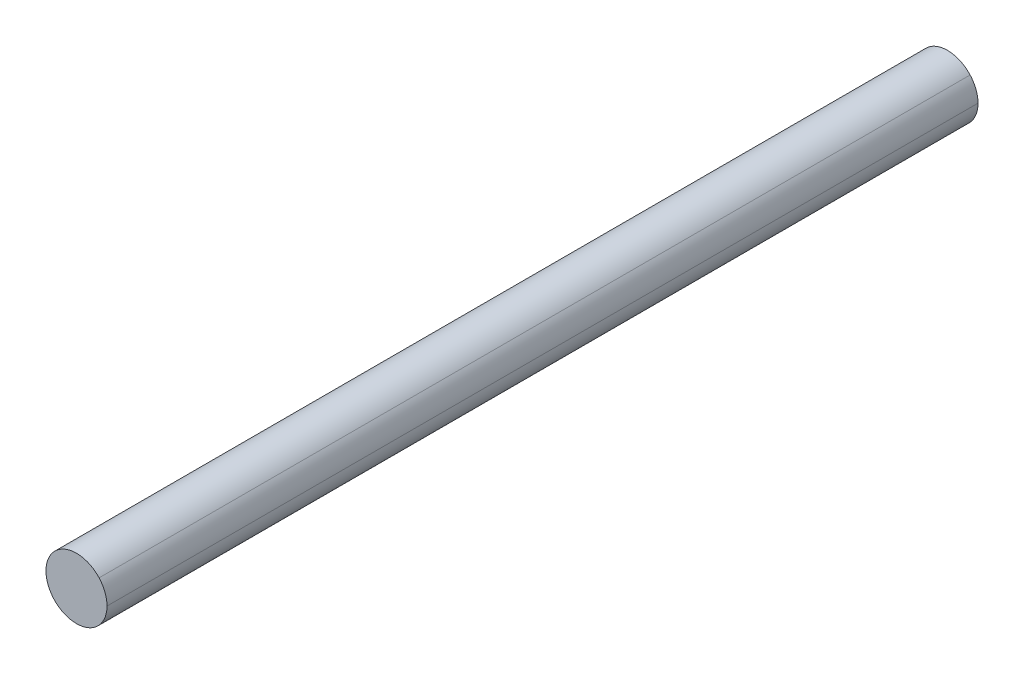
ISO-10303-21;
HEADER;
FILE_DESCRIPTION(('STEP AP214'),'2;1');
FILE_NAME('part.step','',(''),(''),'','','');
FILE_SCHEMA(('AUTOMOTIVE_DESIGN { 1 0 10303 214 1 1 1 1 }'));
ENDSEC;
DATA;
#1=APPLICATION_CONTEXT('core data for automotive mechanical design processes');
#2=APPLICATION_PROTOCOL_DEFINITION('international standard','automotive_design',2000,#1);
#3=PRODUCT_CONTEXT('',#1,'mechanical');
#4=PRODUCT('Part','Part','',(#3));
#5=PRODUCT_RELATED_PRODUCT_CATEGORY('part','',(#4));
#6=PRODUCT_DEFINITION_FORMATION('','',#4);
#7=PRODUCT_DEFINITION_CONTEXT('part definition',#1,'design');
#8=PRODUCT_DEFINITION('design','',#6,#7);
#9=PRODUCT_DEFINITION_SHAPE('','',#8);
#10=(LENGTH_UNIT() NAMED_UNIT(*) SI_UNIT(.MILLI.,.METRE.));
#11=(NAMED_UNIT(*) PLANE_ANGLE_UNIT() SI_UNIT($,.RADIAN.));
#12=(NAMED_UNIT(*) SI_UNIT($,.STERADIAN.) SOLID_ANGLE_UNIT());
#13=UNCERTAINTY_MEASURE_WITH_UNIT(LENGTH_MEASURE(1.E-05),#10,'distance_accuracy_value','');
#14=(GEOMETRIC_REPRESENTATION_CONTEXT(3) GLOBAL_UNCERTAINTY_ASSIGNED_CONTEXT((#13)) GLOBAL_UNIT_ASSIGNED_CONTEXT((#10,
#11,#12)) REPRESENTATION_CONTEXT('',''));
#15=CARTESIAN_POINT('',(0.,0.,0.));
#16=DIRECTION('',(0.,0.,1.));
#17=DIRECTION('',(1.,0.,0.));
#18=AXIS2_PLACEMENT_3D('',#15,#16,#17);
#19=CARTESIAN_POINT('',(59.9749945,1.52500076,2.));
#20=DIRECTION('',(0.,0.,1.));
#21=DIRECTION('',(1.,0.,0.));
#22=AXIS2_PLACEMENT_3D('',#19,#20,#21);
#23=CYLINDRICAL_SURFACE('',#22,0.2452455);
#24=CARTESIAN_POINT('',(59.793174349623,1.360420116584,-1.5));
#25=CARTESIAN_POINT('',(59.793174349623,1.360420116584,5.5));
#26=(BOUNDED_CURVE() B_SPLINE_CURVE(1,(#24,#25),.UNSPECIFIED.,.F.,
.F.) B_SPLINE_CURVE_WITH_KNOTS((2,2),(0.,7.),
.UNSPECIFIED.) CURVE() GEOMETRIC_REPRESENTATION_ITEM() RATIONAL_B_SPLINE_CURVE((1.,1.)) REPRESENTATION_ITEM(''));
#27=CARTESIAN_POINT('',(59.793174349623,1.360420116584,-1.5));
#28=VERTEX_POINT('',#27);
#29=CARTESIAN_POINT('',(59.793174349623,1.360420116584,5.5));
#30=VERTEX_POINT('',#29);
#31=EDGE_CURVE('E62',#28,#30,#26,.T.);
#32=ORIENTED_EDGE('',*,*,#31,.T.);
#33=CARTESIAN_POINT('',(60.156814650377,1.689581403416,5.5));
#34=CARTESIAN_POINT('',(59.99223400696,1.871401553793,5.5));
#35=CARTESIAN_POINT('',(59.810413856584,1.706820910377,5.5));
#36=CARTESIAN_POINT('',(59.628593706207,1.54224026696,5.5));
#37=CARTESIAN_POINT('',(59.793174349623,1.360420116584,5.5));
#38=(BOUNDED_CURVE() B_SPLINE_CURVE(2,(#33,#34,#35,#36,#37),.UNSPECIFIED.,.F.,
.F.) B_SPLINE_CURVE_WITH_KNOTS((3,2,3),(0.,0.746513885726,1.493027771452),
.UNSPECIFIED.) CURVE() GEOMETRIC_REPRESENTATION_ITEM() RATIONAL_B_SPLINE_CURVE((1.,
0.707106781187,1.,0.707106781187,1.)) REPRESENTATION_ITEM(''));
#39=CARTESIAN_POINT('',(60.156814650377,1.689581403416,5.5));
#40=VERTEX_POINT('',#39);
#41=EDGE_CURVE('E20',#40,#30,#38,.T.);
#42=ORIENTED_EDGE('',*,*,#41,.F.);
#43=CARTESIAN_POINT('',(60.156814650377,1.689581403416,-1.5));
#44=CARTESIAN_POINT('',(60.156814650377,1.689581403416,5.5));
#45=(BOUNDED_CURVE() B_SPLINE_CURVE(1,(#43,#44),.UNSPECIFIED.,.F.,
.F.) B_SPLINE_CURVE_WITH_KNOTS((2,2),(0.,7.),
.UNSPECIFIED.) CURVE() GEOMETRIC_REPRESENTATION_ITEM() RATIONAL_B_SPLINE_CURVE((1.,1.)) REPRESENTATION_ITEM(''));
#46=CARTESIAN_POINT('',(60.156814650377,1.689581403416,-1.5));
#47=VERTEX_POINT('',#46);
#48=EDGE_CURVE('E65',#47,#40,#45,.T.);
#49=ORIENTED_EDGE('',*,*,#48,.F.);
#50=CARTESIAN_POINT('',(60.156814650377,1.689581403416,-1.5));
#51=CARTESIAN_POINT('',(59.99223400696,1.871401553793,-1.5));
#52=CARTESIAN_POINT('',(59.810413856584,1.706820910377,-1.5));
#53=CARTESIAN_POINT('',(59.628593706207,1.54224026696,-1.5));
#54=CARTESIAN_POINT('',(59.793174349623,1.360420116584,-1.5));
#55=(BOUNDED_CURVE() B_SPLINE_CURVE(2,(#50,#51,#52,#53,#54),.UNSPECIFIED.,.F.,
.F.) B_SPLINE_CURVE_WITH_KNOTS((3,2,3),(0.,0.746513885726,1.493027771452),
.UNSPECIFIED.) CURVE() GEOMETRIC_REPRESENTATION_ITEM() RATIONAL_B_SPLINE_CURVE((1.,
0.707106781187,1.,0.707106781187,1.)) REPRESENTATION_ITEM(''));
#56=EDGE_CURVE('E11',#47,#28,#55,.T.);
#57=ORIENTED_EDGE('',*,*,#56,.T.);
#58=EDGE_LOOP('',(#32,#42,#49,#57));
#59=FACE_BOUND('',#58,.T.);
#60=ADVANCED_FACE('F17',(#59),#23,.T.);
#61=CARTESIAN_POINT('',(59.668437625,1.218443885,-1.5));
#62=DIRECTION('',(0.,0.,-1.));
#63=DIRECTION('',(0.,-1.,0.));
#64=AXIS2_PLACEMENT_3D('',#61,#62,#63);
#65=PLANE('',#64);
#66=CARTESIAN_POINT('',(59.793174349623,1.360420116584,-1.5));
#67=CARTESIAN_POINT('',(59.95775499304,1.178599966207,-1.5));
#68=CARTESIAN_POINT('',(60.139575143416,1.343180609623,-1.5));
#69=CARTESIAN_POINT('',(60.22024,1.416197126055,-1.5));
#70=CARTESIAN_POINT('',(60.22024,1.52500076,-1.5));
#71=(BOUNDED_CURVE() B_SPLINE_CURVE(2,(#66,#67,#68,#69,#70),.UNSPECIFIED.,.F.,
.F.) B_SPLINE_CURVE_WITH_KNOTS((3,2,3),(1.493027771452,2.239541657177,2.635208033678),
.UNSPECIFIED.) CURVE() GEOMETRIC_REPRESENTATION_ITEM() RATIONAL_B_SPLINE_CURVE((1.,
0.707106781187,1.,0.844761094461,0.854081258542)) REPRESENTATION_ITEM(''));
#72=CARTESIAN_POINT('',(60.22024,1.52500076,-1.5));
#73=VERTEX_POINT('',#72);
#74=EDGE_CURVE('E71',#28,#73,#71,.T.);
#75=ORIENTED_EDGE('',*,*,#74,.F.);
#76=ORIENTED_EDGE('',*,*,#56,.F.);
#77=CARTESIAN_POINT('',(60.22024,1.52500076,-1.5));
#78=CARTESIAN_POINT('',(60.22024,1.619512369982,-1.5));
#79=CARTESIAN_POINT('',(60.156814650377,1.689581403416,-1.5));
#80=(BOUNDED_CURVE() B_SPLINE_CURVE(2,(#77,#78,#79),.UNSPECIFIED.,.F.,
.F.) B_SPLINE_CURVE_WITH_KNOTS((3,3),(2.635208033678,2.986055542903),
.UNSPECIFIED.) CURVE() GEOMETRIC_REPRESENTATION_ITEM() RATIONAL_B_SPLINE_CURVE((0.854081258542,
0.862345686725,1.)) REPRESENTATION_ITEM(''));
#81=EDGE_CURVE('E75',#73,#47,#80,.T.);
#82=ORIENTED_EDGE('',*,*,#81,.F.);
#83=EDGE_LOOP('',(#75,#76,#82));
#84=FACE_BOUND('',#83,.T.);
#85=ADVANCED_FACE('F77',(#84),#65,.T.);
#86=CARTESIAN_POINT('',(59.668437625,1.218443885,5.5));
#87=DIRECTION('',(0.,0.,1.));
#88=DIRECTION('',(1.,0.,0.));
#89=AXIS2_PLACEMENT_3D('',#86,#87,#88);
#90=PLANE('',#89);
#91=ORIENTED_EDGE('',*,*,#41,.T.);
#92=CARTESIAN_POINT('',(59.793174349623,1.360420116584,5.5));
#93=CARTESIAN_POINT('',(59.95775499304,1.178599966207,5.5));
#94=CARTESIAN_POINT('',(60.139575143416,1.343180609623,5.5));
#95=CARTESIAN_POINT('',(60.22024,1.416197126055,5.5));
#96=CARTESIAN_POINT('',(60.22024,1.52500076,5.5));
#97=(BOUNDED_CURVE() B_SPLINE_CURVE(2,(#92,#93,#94,#95,#96),.UNSPECIFIED.,.F.,
.F.) B_SPLINE_CURVE_WITH_KNOTS((3,2,3),(1.493027771452,2.239541657177,2.635208033678),
.UNSPECIFIED.) CURVE() GEOMETRIC_REPRESENTATION_ITEM() RATIONAL_B_SPLINE_CURVE((1.,
0.707106781187,1.,0.844761094461,0.854081258542)) REPRESENTATION_ITEM(''));
#98=CARTESIAN_POINT('',(60.22024,1.52500076,5.5));
#99=VERTEX_POINT('',#98);
#100=EDGE_CURVE('E73',#30,#99,#97,.T.);
#101=ORIENTED_EDGE('',*,*,#100,.T.);
#102=CARTESIAN_POINT('',(60.22024,1.52500076,5.5));
#103=CARTESIAN_POINT('',(60.22024,1.619512369982,5.5));
#104=CARTESIAN_POINT('',(60.156814650377,1.689581403416,5.5));
#105=(BOUNDED_CURVE() B_SPLINE_CURVE(2,(#102,#103,#104),.UNSPECIFIED.,.F.,
.F.) B_SPLINE_CURVE_WITH_KNOTS((3,3),(2.635208033678,2.986055542903),
.UNSPECIFIED.) CURVE() GEOMETRIC_REPRESENTATION_ITEM() RATIONAL_B_SPLINE_CURVE((0.854081258542,
0.862345686725,1.)) REPRESENTATION_ITEM(''));
#106=EDGE_CURVE('E102',#99,#40,#105,.T.);
#107=ORIENTED_EDGE('',*,*,#106,.T.);
#108=EDGE_LOOP('',(#91,#101,#107));
#109=FACE_BOUND('',#108,.T.);
#110=ADVANCED_FACE('F135',(#109),#90,.T.);
#111=CARTESIAN_POINT('',(59.9749945,1.52500076,2.));
#112=DIRECTION('',(0.,0.,1.));
#113=DIRECTION('',(1.,0.,0.));
#114=AXIS2_PLACEMENT_3D('',#111,#112,#113);
#115=CYLINDRICAL_SURFACE('',#114,0.2452455);
#116=DIRECTION('',(0.,0.,1.));
#117=VECTOR('',#116,1.);
#118=CARTESIAN_POINT('',(60.22024,1.52500076,2.));
#119=LINE('',#118,#117);
#120=EDGE_CURVE('E80',#73,#99,#119,.T.);
#121=ORIENTED_EDGE('',*,*,#120,.F.);
#122=ORIENTED_EDGE('',*,*,#81,.T.);
#123=ORIENTED_EDGE('',*,*,#48,.T.);
#124=ORIENTED_EDGE('',*,*,#106,.F.);
#125=EDGE_LOOP('',(#121,#122,#123,#124));
#126=FACE_BOUND('',#125,.T.);
#127=ADVANCED_FACE('F133',(#126),#115,.T.);
#128=CARTESIAN_POINT('',(59.9749945,1.52500076,2.));
#129=DIRECTION('',(0.,0.,1.));
#130=DIRECTION('',(1.,0.,0.));
#131=AXIS2_PLACEMENT_3D('',#128,#129,#130);
#132=CYLINDRICAL_SURFACE('',#131,0.2452455);
#133=ORIENTED_EDGE('',*,*,#74,.T.);
#134=ORIENTED_EDGE('',*,*,#120,.T.);
#135=ORIENTED_EDGE('',*,*,#100,.F.);
#136=ORIENTED_EDGE('',*,*,#31,.F.);
#137=EDGE_LOOP('',(#133,#134,#135,#136));
#138=FACE_BOUND('',#137,.T.);
#139=ADVANCED_FACE('F69',(#138),#132,.T.);
#140=CLOSED_SHELL('',(#60,#85,#110,#127,#139));
#141=MANIFOLD_SOLID_BREP('B1',#140);
#142=ADVANCED_BREP_SHAPE_REPRESENTATION('',(#18,#141),#14);
#143=SHAPE_DEFINITION_REPRESENTATION(#9,#142);
ENDSEC;
END-ISO-10303-21;
